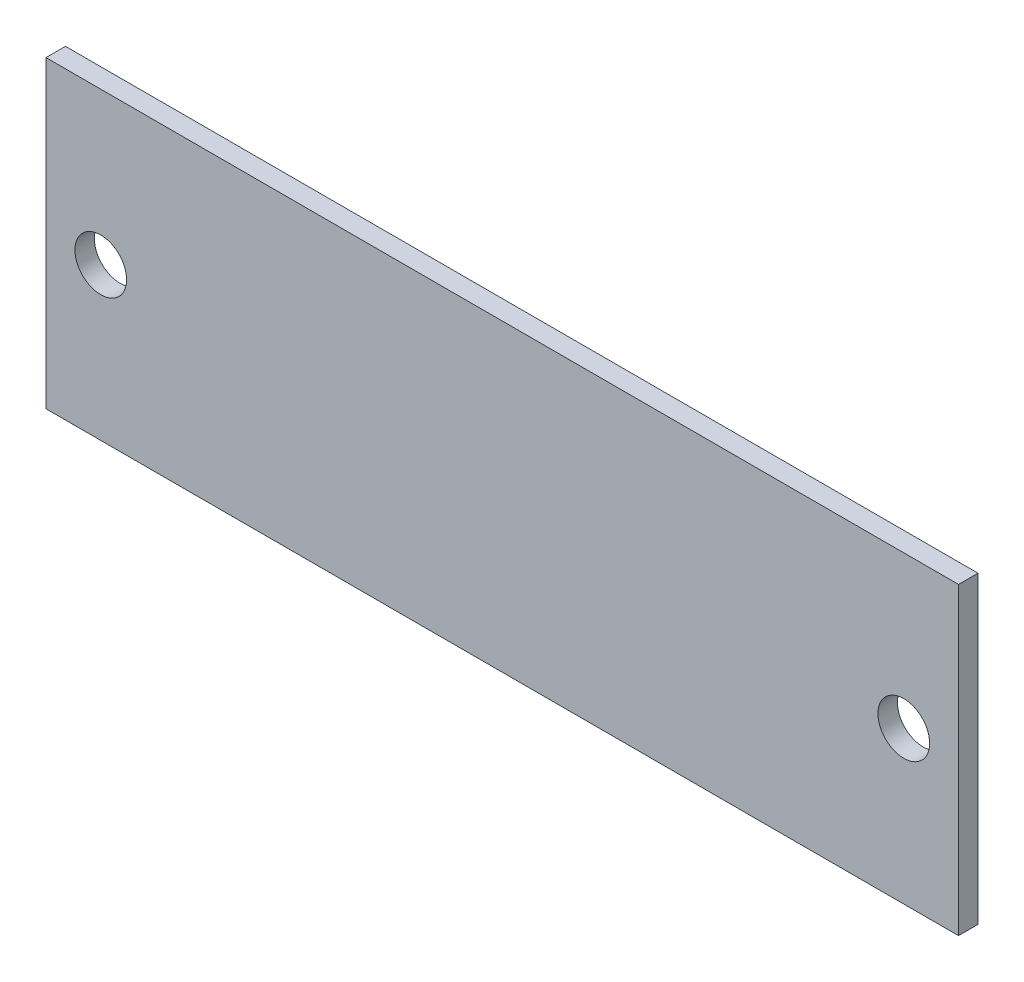
ISO-10303-21;
HEADER;
FILE_DESCRIPTION(('STEP AP214'),'2;1');
FILE_NAME('part.step','',(''),(''),'','','');
FILE_SCHEMA(('AUTOMOTIVE_DESIGN { 1 0 10303 214 1 1 1 1 }'));
ENDSEC;
DATA;
#1=APPLICATION_CONTEXT('core data for automotive mechanical design processes');
#2=APPLICATION_PROTOCOL_DEFINITION('international standard','automotive_design',2000,#1);
#3=PRODUCT_CONTEXT('',#1,'mechanical');
#4=PRODUCT('Part','Part','',(#3));
#5=PRODUCT_RELATED_PRODUCT_CATEGORY('part','',(#4));
#6=PRODUCT_DEFINITION_FORMATION('','',#4);
#7=PRODUCT_DEFINITION_CONTEXT('part definition',#1,'design');
#8=PRODUCT_DEFINITION('design','',#6,#7);
#9=PRODUCT_DEFINITION_SHAPE('','',#8);
#10=(LENGTH_UNIT() NAMED_UNIT(*) SI_UNIT(.MILLI.,.METRE.));
#11=(NAMED_UNIT(*) PLANE_ANGLE_UNIT() SI_UNIT($,.RADIAN.));
#12=(NAMED_UNIT(*) SI_UNIT($,.STERADIAN.) SOLID_ANGLE_UNIT());
#13=UNCERTAINTY_MEASURE_WITH_UNIT(LENGTH_MEASURE(1.E-05),#10,'distance_accuracy_value','');
#14=(GEOMETRIC_REPRESENTATION_CONTEXT(3) GLOBAL_UNCERTAINTY_ASSIGNED_CONTEXT((#13)) GLOBAL_UNIT_ASSIGNED_CONTEXT((#10,
#11,#12)) REPRESENTATION_CONTEXT('',''));
#15=CARTESIAN_POINT('',(0.,0.,0.));
#16=DIRECTION('',(0.,0.,1.));
#17=DIRECTION('',(1.,0.,0.));
#18=AXIS2_PLACEMENT_3D('',#15,#16,#17);
#19=CARTESIAN_POINT('',(-38.1,-12.7,-1.6256));
#20=DIRECTION('',(-1.,0.,0.));
#21=DIRECTION('',(0.,0.,1.));
#22=AXIS2_PLACEMENT_3D('',#19,#20,#21);
#23=PLANE('',#22);
#24=DIRECTION('',(0.,-1.,0.));
#25=VECTOR('',#24,1.);
#26=CARTESIAN_POINT('',(-38.1,-12.7,0.));
#27=LINE('',#26,#25);
#28=CARTESIAN_POINT('',(-38.1,12.7,0.));
#29=VERTEX_POINT('',#28);
#30=CARTESIAN_POINT('',(-38.1,-12.7,0.));
#31=VERTEX_POINT('',#30);
#32=EDGE_CURVE('E102',#29,#31,#27,.T.);
#33=ORIENTED_EDGE('',*,*,#32,.F.);
#34=DIRECTION('',(0.,0.,1.));
#35=VECTOR('',#34,1.);
#36=CARTESIAN_POINT('',(-38.1,12.7,-1.6256));
#37=LINE('',#36,#35);
#38=CARTESIAN_POINT('',(-38.1,12.7,-1.6256));
#39=VERTEX_POINT('',#38);
#40=EDGE_CURVE('E11',#39,#29,#37,.T.);
#41=ORIENTED_EDGE('',*,*,#40,.F.);
#42=DIRECTION('',(0.,-1.,0.));
#43=VECTOR('',#42,1.);
#44=CARTESIAN_POINT('',(-38.1,-12.7,-1.6256));
#45=LINE('',#44,#43);
#46=CARTESIAN_POINT('',(-38.1,-12.7,-1.6256));
#47=VERTEX_POINT('',#46);
#48=EDGE_CURVE('E95',#39,#47,#45,.T.);
#49=ORIENTED_EDGE('',*,*,#48,.T.);
#50=DIRECTION('',(0.,0.,1.));
#51=VECTOR('',#50,1.);
#52=CARTESIAN_POINT('',(-38.1,-12.7,-1.6256));
#53=LINE('',#52,#51);
#54=EDGE_CURVE('E40',#47,#31,#53,.T.);
#55=ORIENTED_EDGE('',*,*,#54,.T.);
#56=EDGE_LOOP('',(#33,#41,#49,#55));
#57=FACE_BOUND('',#56,.T.);
#58=ADVANCED_FACE('F37',(#57),#23,.T.);
#59=CARTESIAN_POINT('',(-38.1,12.7,-1.6256));
#60=DIRECTION('',(0.,1.,0.));
#61=DIRECTION('',(0.,0.,1.));
#62=AXIS2_PLACEMENT_3D('',#59,#60,#61);
#63=PLANE('',#62);
#64=DIRECTION('',(-1.,0.,0.));
#65=VECTOR('',#64,1.);
#66=CARTESIAN_POINT('',(-38.1,12.7,0.));
#67=LINE('',#66,#65);
#68=CARTESIAN_POINT('',(38.1,12.7,0.));
#69=VERTEX_POINT('',#68);
#70=EDGE_CURVE('E97',#69,#29,#67,.T.);
#71=ORIENTED_EDGE('',*,*,#70,.F.);
#72=DIRECTION('',(0.,0.,1.));
#73=VECTOR('',#72,1.);
#74=CARTESIAN_POINT('',(38.1,12.7,-1.6256));
#75=LINE('',#74,#73);
#76=CARTESIAN_POINT('',(38.1,12.7,-1.6256));
#77=VERTEX_POINT('',#76);
#78=EDGE_CURVE('E46',#77,#69,#75,.T.);
#79=ORIENTED_EDGE('',*,*,#78,.F.);
#80=DIRECTION('',(-1.,0.,0.));
#81=VECTOR('',#80,1.);
#82=CARTESIAN_POINT('',(-38.1,12.7,-1.6256));
#83=LINE('',#82,#81);
#84=EDGE_CURVE('E92',#77,#39,#83,.T.);
#85=ORIENTED_EDGE('',*,*,#84,.T.);
#86=ORIENTED_EDGE('',*,*,#40,.T.);
#87=EDGE_LOOP('',(#71,#79,#85,#86));
#88=FACE_BOUND('',#87,.T.);
#89=ADVANCED_FACE('F113',(#88),#63,.T.);
#90=CARTESIAN_POINT('',(38.1,12.7,-1.6256));
#91=DIRECTION('',(1.,0.,0.));
#92=DIRECTION('',(0.,0.,-1.));
#93=AXIS2_PLACEMENT_3D('',#90,#91,#92);
#94=PLANE('',#93);
#95=DIRECTION('',(0.,1.,0.));
#96=VECTOR('',#95,1.);
#97=CARTESIAN_POINT('',(38.1,12.7,0.));
#98=LINE('',#97,#96);
#99=CARTESIAN_POINT('',(38.1,-12.7,0.));
#100=VERTEX_POINT('',#99);
#101=EDGE_CURVE('E87',#100,#69,#98,.T.);
#102=ORIENTED_EDGE('',*,*,#101,.F.);
#103=DIRECTION('',(0.,0.,1.));
#104=VECTOR('',#103,1.);
#105=CARTESIAN_POINT('',(38.1,-12.7,-1.6256));
#106=LINE('',#105,#104);
#107=CARTESIAN_POINT('',(38.1,-12.7,-1.6256));
#108=VERTEX_POINT('',#107);
#109=EDGE_CURVE('E82',#108,#100,#106,.T.);
#110=ORIENTED_EDGE('',*,*,#109,.F.);
#111=DIRECTION('',(0.,1.,0.));
#112=VECTOR('',#111,1.);
#113=CARTESIAN_POINT('',(38.1,12.7,-1.6256));
#114=LINE('',#113,#112);
#115=EDGE_CURVE('E85',#108,#77,#114,.T.);
#116=ORIENTED_EDGE('',*,*,#115,.T.);
#117=ORIENTED_EDGE('',*,*,#78,.T.);
#118=EDGE_LOOP('',(#102,#110,#116,#117));
#119=FACE_BOUND('',#118,.T.);
#120=ADVANCED_FACE('F84',(#119),#94,.T.);
#121=CARTESIAN_POINT('',(38.1,-12.7,-1.6256));
#122=DIRECTION('',(0.,-1.,0.));
#123=DIRECTION('',(1.,0.,0.));
#124=AXIS2_PLACEMENT_3D('',#121,#122,#123);
#125=PLANE('',#124);
#126=DIRECTION('',(1.,0.,0.));
#127=VECTOR('',#126,1.);
#128=CARTESIAN_POINT('',(38.1,-12.7,0.));
#129=LINE('',#128,#127);
#130=EDGE_CURVE('E105',#31,#100,#129,.T.);
#131=ORIENTED_EDGE('',*,*,#130,.F.);
#132=ORIENTED_EDGE('',*,*,#54,.F.);
#133=DIRECTION('',(1.,0.,0.));
#134=VECTOR('',#133,1.);
#135=CARTESIAN_POINT('',(38.1,-12.7,-1.6256));
#136=LINE('',#135,#134);
#137=EDGE_CURVE('E91',#47,#108,#136,.T.);
#138=ORIENTED_EDGE('',*,*,#137,.T.);
#139=ORIENTED_EDGE('',*,*,#109,.T.);
#140=EDGE_LOOP('',(#131,#132,#138,#139));
#141=FACE_BOUND('',#140,.T.);
#142=ADVANCED_FACE('F94',(#141),#125,.T.);
#143=CARTESIAN_POINT('',(0.,0.,-1.6256));
#144=DIRECTION('',(0.,0.,-1.));
#145=DIRECTION('',(-1.,0.,0.));
#146=AXIS2_PLACEMENT_3D('',#143,#144,#145);
#147=PLANE('',#146);
#148=CARTESIAN_POINT('',(33.528,0.,-1.6256));
#149=DIRECTION('',(0.,0.,1.));
#150=DIRECTION('',(1.,0.,0.));
#151=AXIS2_PLACEMENT_3D('',#148,#149,#150);
#152=CIRCLE('',#151,2.159);
#153=CARTESIAN_POINT('',(35.687,0.,-1.6256));
#154=VERTEX_POINT('',#153);
#155=EDGE_CURVE('E106',#154,#154,#152,.T.);
#156=ORIENTED_EDGE('',*,*,#155,.T.);
#157=EDGE_LOOP('',(#156));
#158=FACE_BOUND('',#157,.T.);
#159=CARTESIAN_POINT('',(-33.528,0.,-1.6256));
#160=DIRECTION('',(0.,0.,1.));
#161=DIRECTION('',(-1.,0.,0.));
#162=AXIS2_PLACEMENT_3D('',#159,#160,#161);
#163=CIRCLE('',#162,2.159);
#164=CARTESIAN_POINT('',(-35.687,0.,-1.6256));
#165=VERTEX_POINT('',#164);
#166=EDGE_CURVE('E149',#165,#165,#163,.T.);
#167=ORIENTED_EDGE('',*,*,#166,.T.);
#168=EDGE_LOOP('',(#167));
#169=FACE_BOUND('',#168,.T.);
#170=ORIENTED_EDGE('',*,*,#48,.F.);
#171=ORIENTED_EDGE('',*,*,#84,.F.);
#172=ORIENTED_EDGE('',*,*,#115,.F.);
#173=ORIENTED_EDGE('',*,*,#137,.F.);
#174=EDGE_LOOP('',(#170,#171,#172,#173));
#175=FACE_BOUND('',#174,.T.);
#176=ADVANCED_FACE('F90',(#158,#169,#175),#147,.T.);
#177=CARTESIAN_POINT('',(0.,0.,0.));
#178=DIRECTION('',(0.,0.,-1.));
#179=DIRECTION('',(-1.,0.,0.));
#180=AXIS2_PLACEMENT_3D('',#177,#178,#179);
#181=PLANE('',#180);
#182=CARTESIAN_POINT('',(33.528,0.,0.));
#183=DIRECTION('',(0.,0.,1.));
#184=DIRECTION('',(1.,0.,0.));
#185=AXIS2_PLACEMENT_3D('',#182,#183,#184);
#186=CIRCLE('',#185,2.159);
#187=CARTESIAN_POINT('',(35.687,0.,0.));
#188=VERTEX_POINT('',#187);
#189=EDGE_CURVE('E148',#188,#188,#186,.T.);
#190=ORIENTED_EDGE('',*,*,#189,.F.);
#191=EDGE_LOOP('',(#190));
#192=FACE_BOUND('',#191,.T.);
#193=CARTESIAN_POINT('',(-33.528,0.,0.));
#194=DIRECTION('',(0.,0.,1.));
#195=DIRECTION('',(-1.,0.,0.));
#196=AXIS2_PLACEMENT_3D('',#193,#194,#195);
#197=CIRCLE('',#196,2.159);
#198=CARTESIAN_POINT('',(-35.687,0.,0.));
#199=VERTEX_POINT('',#198);
#200=EDGE_CURVE('E153',#199,#199,#197,.T.);
#201=ORIENTED_EDGE('',*,*,#200,.F.);
#202=EDGE_LOOP('',(#201));
#203=FACE_BOUND('',#202,.T.);
#204=ORIENTED_EDGE('',*,*,#32,.T.);
#205=ORIENTED_EDGE('',*,*,#130,.T.);
#206=ORIENTED_EDGE('',*,*,#101,.T.);
#207=ORIENTED_EDGE('',*,*,#70,.T.);
#208=EDGE_LOOP('',(#204,#205,#206,#207));
#209=FACE_BOUND('',#208,.T.);
#210=ADVANCED_FACE('F112',(#192,#203,#209),#181,.F.);
#211=CARTESIAN_POINT('',(-33.528,0.,-1.6256));
#212=DIRECTION('',(0.,0.,1.));
#213=DIRECTION('',(1.,0.,0.));
#214=AXIS2_PLACEMENT_3D('',#211,#212,#213);
#215=CYLINDRICAL_SURFACE('',#214,2.159);
#216=ORIENTED_EDGE('',*,*,#166,.F.);
#217=EDGE_LOOP('',(#216));
#218=FACE_BOUND('',#217,.T.);
#219=ORIENTED_EDGE('',*,*,#200,.T.);
#220=EDGE_LOOP('',(#219));
#221=FACE_BOUND('',#220,.T.);
#222=ADVANCED_FACE('F131',(#218,#221),#215,.F.);
#223=CARTESIAN_POINT('',(33.528,0.,-1.6256));
#224=DIRECTION('',(0.,0.,1.));
#225=DIRECTION('',(1.,0.,0.));
#226=AXIS2_PLACEMENT_3D('',#223,#224,#225);
#227=CYLINDRICAL_SURFACE('',#226,2.159);
#228=ORIENTED_EDGE('',*,*,#155,.F.);
#229=EDGE_LOOP('',(#228));
#230=FACE_BOUND('',#229,.T.);
#231=ORIENTED_EDGE('',*,*,#189,.T.);
#232=EDGE_LOOP('',(#231));
#233=FACE_BOUND('',#232,.T.);
#234=ADVANCED_FACE('F138',(#230,#233),#227,.F.);
#235=CLOSED_SHELL('',(#58,#89,#120,#142,#176,#210,#222,#234));
#236=MANIFOLD_SOLID_BREP('B2',#235);
#237=ADVANCED_BREP_SHAPE_REPRESENTATION('',(#18,#236),#14);
#238=SHAPE_DEFINITION_REPRESENTATION(#9,#237);
ENDSEC;
END-ISO-10303-21;
